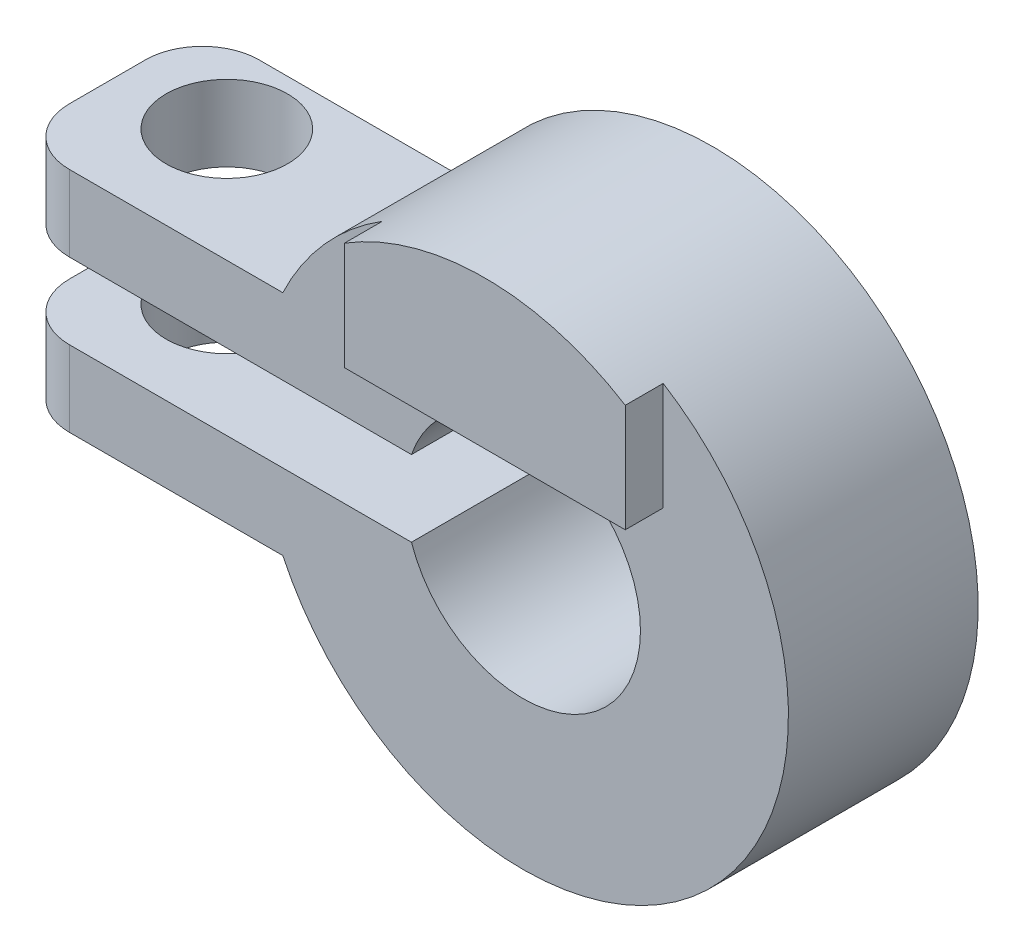
ISO-10303-21;
HEADER;
FILE_DESCRIPTION(('STEP AP214'),'2;1');
FILE_NAME('part.step','',(''),(''),'','','');
FILE_SCHEMA(('AUTOMOTIVE_DESIGN { 1 0 10303 214 1 1 1 1 }'));
ENDSEC;
DATA;
#1=APPLICATION_CONTEXT('core data for automotive mechanical design processes');
#2=APPLICATION_PROTOCOL_DEFINITION('international standard','automotive_design',2000,#1);
#3=PRODUCT_CONTEXT('',#1,'mechanical');
#4=PRODUCT('Part','Part','',(#3));
#5=PRODUCT_RELATED_PRODUCT_CATEGORY('part','',(#4));
#6=PRODUCT_DEFINITION_FORMATION('','',#4);
#7=PRODUCT_DEFINITION_CONTEXT('part definition',#1,'design');
#8=PRODUCT_DEFINITION('design','',#6,#7);
#9=PRODUCT_DEFINITION_SHAPE('','',#8);
#10=(LENGTH_UNIT() NAMED_UNIT(*) SI_UNIT(.MILLI.,.METRE.));
#11=(NAMED_UNIT(*) PLANE_ANGLE_UNIT() SI_UNIT($,.RADIAN.));
#12=(NAMED_UNIT(*) SI_UNIT($,.STERADIAN.) SOLID_ANGLE_UNIT());
#13=UNCERTAINTY_MEASURE_WITH_UNIT(LENGTH_MEASURE(1.E-05),#10,'distance_accuracy_value','');
#14=(GEOMETRIC_REPRESENTATION_CONTEXT(3) GLOBAL_UNCERTAINTY_ASSIGNED_CONTEXT((#13)) GLOBAL_UNIT_ASSIGNED_CONTEXT((#10,
#11,#12)) REPRESENTATION_CONTEXT('',''));
#15=CARTESIAN_POINT('',(0.,0.,0.));
#16=DIRECTION('',(0.,0.,1.));
#17=DIRECTION('',(1.,0.,0.));
#18=AXIS2_PLACEMENT_3D('',#15,#16,#17);
#19=CARTESIAN_POINT('',(0.,3.1,2.));
#20=DIRECTION('',(0.,-1.,0.));
#21=DIRECTION('',(0.,0.,-1.));
#22=AXIS2_PLACEMENT_3D('',#19,#20,#21);
#23=PLANE('',#22);
#24=DIRECTION('',(0.,0.,1.));
#25=VECTOR('',#24,1.);
#26=CARTESIAN_POINT('',(3.7,3.1,-1.));
#27=LINE('',#26,#25);
#28=CARTESIAN_POINT('',(3.7,3.1,-1.));
#29=VERTEX_POINT('',#28);
#30=CARTESIAN_POINT('',(3.7,3.1,0.));
#31=VERTEX_POINT('',#30);
#32=EDGE_CURVE('E184',#29,#31,#27,.T.);
#33=ORIENTED_EDGE('',*,*,#32,.T.);
#34=DIRECTION('',(-1.,0.,0.));
#35=VECTOR('',#34,1.);
#36=CARTESIAN_POINT('',(0.,3.1,0.));
#37=LINE('',#36,#35);
#38=CARTESIAN_POINT('',(-3.7,3.1,0.));
#39=VERTEX_POINT('',#38);
#40=EDGE_CURVE('E166',#31,#39,#37,.T.);
#41=ORIENTED_EDGE('',*,*,#40,.T.);
#42=DIRECTION('',(0.,0.,1.));
#43=VECTOR('',#42,1.);
#44=CARTESIAN_POINT('',(-3.7,3.1,-1.));
#45=LINE('',#44,#43);
#46=CARTESIAN_POINT('',(-3.7,3.1,-1.));
#47=VERTEX_POINT('',#46);
#48=EDGE_CURVE('E181',#47,#39,#45,.T.);
#49=ORIENTED_EDGE('',*,*,#48,.F.);
#50=DIRECTION('',(-1.,0.,0.));
#51=VECTOR('',#50,1.);
#52=CARTESIAN_POINT('',(0.,3.1,-1.));
#53=LINE('',#52,#51);
#54=CARTESIAN_POINT('',(0.,3.1,-1.));
#55=VERTEX_POINT('',#54);
#56=EDGE_CURVE('E301',#55,#47,#53,.T.);
#57=ORIENTED_EDGE('',*,*,#56,.F.);
#58=EDGE_CURVE('E297',#29,#55,#53,.T.);
#59=ORIENTED_EDGE('',*,*,#58,.F.);
#60=EDGE_LOOP('',(#33,#41,#49,#57,#59));
#61=FACE_BOUND('',#60,.T.);
#62=ADVANCED_FACE('F44',(#61),#23,.T.);
#63=CARTESIAN_POINT('',(0.,0.,-1.));
#64=DIRECTION('',(0.,0.,-1.));
#65=DIRECTION('',(-1.,0.,0.));
#66=AXIS2_PLACEMENT_3D('',#63,#64,#65);
#67=PLANE('',#66);
#68=DIRECTION('',(1.,0.,0.));
#69=VECTOR('',#68,1.);
#70=CARTESIAN_POINT('',(-13.4474013388617,-0.999999999999999,-1.));
#71=LINE('',#70,#69);
#72=CARTESIAN_POINT('',(-11.9474013388617,-0.999999999999999,-1.));
#73=VERTEX_POINT('',#72);
#74=CARTESIAN_POINT('',(-2.93428015022424,-0.999999999999999,-1.));
#75=VERTEX_POINT('',#74);
#76=EDGE_CURVE('E274',#73,#75,#71,.T.);
#77=ORIENTED_EDGE('',*,*,#76,.F.);
#78=DIRECTION('',(0.,1.,0.));
#79=VECTOR('',#78,1.);
#80=CARTESIAN_POINT('',(-11.9474013388617,-3.,-1.));
#81=LINE('',#80,#79);
#82=CARTESIAN_POINT('',(-11.9474013388617,-3.,-1.));
#83=VERTEX_POINT('',#82);
#84=EDGE_CURVE('E68',#73,#83,#81,.F.);
#85=ORIENTED_EDGE('',*,*,#84,.T.);
#86=DIRECTION('',(-1.,0.,0.));
#87=VECTOR('',#86,1.);
#88=CARTESIAN_POINT('',(-5.44740133886171,-3.,-1.));
#89=LINE('',#88,#87);
#90=CARTESIAN_POINT('',(-6.32455532033676,-3.,-1.));
#91=VERTEX_POINT('',#90);
#92=EDGE_CURVE('E268',#91,#83,#89,.T.);
#93=ORIENTED_EDGE('',*,*,#92,.F.);
#94=CARTESIAN_POINT('',(0.,0.,-1.));
#95=DIRECTION('',(0.,0.,-1.));
#96=DIRECTION('',(-1.,0.,0.));
#97=AXIS2_PLACEMENT_3D('',#94,#95,#96);
#98=CIRCLE('',#97,7.);
#99=CARTESIAN_POINT('',(3.7,5.94222180669823,-1.));
#100=VERTEX_POINT('',#99);
#101=EDGE_CURVE('E294',#100,#91,#98,.T.);
#102=ORIENTED_EDGE('',*,*,#101,.F.);
#103=DIRECTION('',(0.,-1.,0.));
#104=VECTOR('',#103,1.);
#105=CARTESIAN_POINT('',(3.7,3.1,-1.));
#106=LINE('',#105,#104);
#107=EDGE_CURVE('E195',#100,#29,#106,.T.);
#108=ORIENTED_EDGE('',*,*,#107,.T.);
#109=ORIENTED_EDGE('',*,*,#58,.T.);
#110=CARTESIAN_POINT('',(0.,0.,-1.));
#111=DIRECTION('',(0.,0.,-1.));
#112=DIRECTION('',(-1.,0.,0.));
#113=AXIS2_PLACEMENT_3D('',#110,#111,#112);
#114=CIRCLE('',#113,3.1);
#115=EDGE_CURVE('E287',#55,#75,#114,.T.);
#116=ORIENTED_EDGE('',*,*,#115,.T.);
#117=EDGE_LOOP('',(#77,#85,#93,#102,#108,#109,#116));
#118=FACE_BOUND('',#117,.T.);
#119=ADVANCED_FACE('F316',(#118),#67,.F.);
#120=CARTESIAN_POINT('',(-3.7,3.1,-1.));
#121=DIRECTION('',(1.,0.,0.));
#122=DIRECTION('',(0.,0.,-1.));
#123=AXIS2_PLACEMENT_3D('',#120,#121,#122);
#124=PLANE('',#123);
#125=DIRECTION('',(0.,1.,0.));
#126=VECTOR('',#125,1.);
#127=CARTESIAN_POINT('',(-3.7,3.1,0.));
#128=LINE('',#127,#126);
#129=CARTESIAN_POINT('',(-3.7,5.94222180669823,0.));
#130=VERTEX_POINT('',#129);
#131=EDGE_CURVE('E163',#39,#130,#128,.T.);
#132=ORIENTED_EDGE('',*,*,#131,.T.);
#133=DIRECTION('',(0.,0.,-1.));
#134=VECTOR('',#133,1.);
#135=CARTESIAN_POINT('',(-3.7,5.94222180669823,0.));
#136=LINE('',#135,#134);
#137=CARTESIAN_POINT('',(-3.7,5.94222180669823,-1.));
#138=VERTEX_POINT('',#137);
#139=EDGE_CURVE('E324',#130,#138,#136,.T.);
#140=ORIENTED_EDGE('',*,*,#139,.T.);
#141=DIRECTION('',(0.,1.,0.));
#142=VECTOR('',#141,1.);
#143=CARTESIAN_POINT('',(-3.7,3.1,-1.));
#144=LINE('',#143,#142);
#145=EDGE_CURVE('E190',#47,#138,#144,.T.);
#146=ORIENTED_EDGE('',*,*,#145,.F.);
#147=ORIENTED_EDGE('',*,*,#48,.T.);
#148=EDGE_LOOP('',(#132,#140,#146,#147));
#149=FACE_BOUND('',#148,.T.);
#150=ADVANCED_FACE('F188',(#149),#124,.F.);
#151=CARTESIAN_POINT('',(3.7,3.1,-1.));
#152=DIRECTION('',(-1.,0.,0.));
#153=DIRECTION('',(0.,0.,1.));
#154=AXIS2_PLACEMENT_3D('',#151,#152,#153);
#155=PLANE('',#154);
#156=ORIENTED_EDGE('',*,*,#107,.F.);
#157=DIRECTION('',(0.,0.,-1.));
#158=VECTOR('',#157,1.);
#159=CARTESIAN_POINT('',(3.7,5.94222180669823,0.));
#160=LINE('',#159,#158);
#161=CARTESIAN_POINT('',(3.7,5.94222180669823,0.));
#162=VERTEX_POINT('',#161);
#163=EDGE_CURVE('E331',#100,#162,#160,.F.);
#164=ORIENTED_EDGE('',*,*,#163,.T.);
#165=DIRECTION('',(0.,-1.,0.));
#166=VECTOR('',#165,1.);
#167=CARTESIAN_POINT('',(3.7,3.1,0.));
#168=LINE('',#167,#166);
#169=EDGE_CURVE('E175',#162,#31,#168,.T.);
#170=ORIENTED_EDGE('',*,*,#169,.T.);
#171=ORIENTED_EDGE('',*,*,#32,.F.);
#172=EDGE_LOOP('',(#156,#164,#170,#171));
#173=FACE_BOUND('',#172,.T.);
#174=ADVANCED_FACE('F449',(#173),#155,.F.);
#175=CARTESIAN_POINT('',(0.,0.,-6.));
#176=DIRECTION('',(0.,0.,-1.));
#177=DIRECTION('',(-1.,0.,0.));
#178=AXIS2_PLACEMENT_3D('',#175,#176,#177);
#179=PLANE('',#178);
#180=DIRECTION('',(1.,0.,0.));
#181=VECTOR('',#180,1.);
#182=CARTESIAN_POINT('',(-13.4474013388617,3.,-6.));
#183=LINE('',#182,#181);
#184=CARTESIAN_POINT('',(-11.9474013388617,3.,-6.));
#185=VERTEX_POINT('',#184);
#186=CARTESIAN_POINT('',(-6.32455532033676,3.,-6.));
#187=VERTEX_POINT('',#186);
#188=EDGE_CURVE('E272',#185,#187,#183,.T.);
#189=ORIENTED_EDGE('',*,*,#188,.T.);
#190=CARTESIAN_POINT('',(0.,0.,-6.));
#191=DIRECTION('',(0.,0.,-1.));
#192=DIRECTION('',(-1.,0.,0.));
#193=AXIS2_PLACEMENT_3D('',#190,#191,#192);
#194=CIRCLE('',#193,7.);
#195=CARTESIAN_POINT('',(-6.32455532033676,-3.,-6.));
#196=VERTEX_POINT('',#195);
#197=EDGE_CURVE('E176',#187,#196,#194,.T.);
#198=ORIENTED_EDGE('',*,*,#197,.T.);
#199=DIRECTION('',(-1.,0.,0.));
#200=VECTOR('',#199,1.);
#201=CARTESIAN_POINT('',(-5.44740133886171,-3.,-6.));
#202=LINE('',#201,#200);
#203=CARTESIAN_POINT('',(-11.9474013388617,-3.,-6.));
#204=VERTEX_POINT('',#203);
#205=EDGE_CURVE('E258',#196,#204,#202,.T.);
#206=ORIENTED_EDGE('',*,*,#205,.T.);
#207=DIRECTION('',(0.,1.,0.));
#208=VECTOR('',#207,1.);
#209=CARTESIAN_POINT('',(-11.9474013388617,0.,-6.));
#210=LINE('',#209,#208);
#211=CARTESIAN_POINT('',(-11.9474013388617,-0.999999999999999,-6.));
#212=VERTEX_POINT('',#211);
#213=EDGE_CURVE('E53',#204,#212,#210,.T.);
#214=ORIENTED_EDGE('',*,*,#213,.T.);
#215=DIRECTION('',(1.,0.,0.));
#216=VECTOR('',#215,1.);
#217=CARTESIAN_POINT('',(-13.4474013388617,-0.999999999999999,-6.));
#218=LINE('',#217,#216);
#219=CARTESIAN_POINT('',(-2.93428015022424,-0.999999999999999,-6.));
#220=VERTEX_POINT('',#219);
#221=EDGE_CURVE('E255',#212,#220,#218,.T.);
#222=ORIENTED_EDGE('',*,*,#221,.T.);
#223=CARTESIAN_POINT('',(0.,0.,-6.));
#224=DIRECTION('',(0.,0.,-1.));
#225=DIRECTION('',(-1.,0.,0.));
#226=AXIS2_PLACEMENT_3D('',#223,#224,#225);
#227=CIRCLE('',#226,3.1);
#228=CARTESIAN_POINT('',(-2.93428015022424,1.,-6.));
#229=VERTEX_POINT('',#228);
#230=EDGE_CURVE('E283',#229,#220,#227,.T.);
#231=ORIENTED_EDGE('',*,*,#230,.F.);
#232=DIRECTION('',(-1.,0.,0.));
#233=VECTOR('',#232,1.);
#234=CARTESIAN_POINT('',(-5.44740133886171,1.,-6.));
#235=LINE('',#234,#233);
#236=CARTESIAN_POINT('',(-11.9474013388617,1.,-6.));
#237=VERTEX_POINT('',#236);
#238=EDGE_CURVE('E354',#229,#237,#235,.T.);
#239=ORIENTED_EDGE('',*,*,#238,.T.);
#240=DIRECTION('',(0.,1.,0.));
#241=VECTOR('',#240,1.);
#242=CARTESIAN_POINT('',(-11.9474013388617,0.,-6.));
#243=LINE('',#242,#241);
#244=EDGE_CURVE('E11',#237,#185,#243,.T.);
#245=ORIENTED_EDGE('',*,*,#244,.T.);
#246=EDGE_LOOP('',(#189,#198,#206,#214,#222,#231,#239,#245));
#247=FACE_BOUND('',#246,.T.);
#248=ADVANCED_FACE('F254',(#247),#179,.T.);
#249=DIRECTION('',(1.,0.,0.));
#250=VECTOR('',#249,1.);
#251=CARTESIAN_POINT('',(-13.4474013388617,3.,-1.));
#252=LINE('',#251,#250);
#253=CARTESIAN_POINT('',(-11.9474013388617,3.,-1.));
#254=VERTEX_POINT('',#253);
#255=CARTESIAN_POINT('',(-6.32455532033676,3.,-1.));
#256=VERTEX_POINT('',#255);
#257=EDGE_CURVE('E350',#254,#256,#252,.T.);
#258=ORIENTED_EDGE('',*,*,#257,.F.);
#259=DIRECTION('',(0.,1.,0.));
#260=VECTOR('',#259,1.);
#261=CARTESIAN_POINT('',(-11.9474013388617,1.,-1.));
#262=LINE('',#261,#260);
#263=CARTESIAN_POINT('',(-11.9474013388617,1.,-1.));
#264=VERTEX_POINT('',#263);
#265=EDGE_CURVE('E219',#254,#264,#262,.F.);
#266=ORIENTED_EDGE('',*,*,#265,.T.);
#267=DIRECTION('',(-1.,0.,0.));
#268=VECTOR('',#267,1.);
#269=CARTESIAN_POINT('',(-5.44740133886171,1.,-1.));
#270=LINE('',#269,#268);
#271=CARTESIAN_POINT('',(-2.93428015022424,1.,-1.));
#272=VERTEX_POINT('',#271);
#273=EDGE_CURVE('E353',#272,#264,#270,.T.);
#274=ORIENTED_EDGE('',*,*,#273,.F.);
#275=EDGE_CURVE('E291',#272,#55,#114,.T.);
#276=ORIENTED_EDGE('',*,*,#275,.T.);
#277=ORIENTED_EDGE('',*,*,#56,.T.);
#278=ORIENTED_EDGE('',*,*,#145,.T.);
#279=EDGE_CURVE('E286',#256,#138,#98,.T.);
#280=ORIENTED_EDGE('',*,*,#279,.F.);
#281=EDGE_LOOP('',(#258,#266,#274,#276,#277,#278,#280));
#282=FACE_BOUND('',#281,.T.);
#283=ADVANCED_FACE('F312',(#282),#67,.F.);
#284=CARTESIAN_POINT('',(0.,0.,-6.));
#285=DIRECTION('',(0.,0.,1.));
#286=DIRECTION('',(1.,0.,0.));
#287=AXIS2_PLACEMENT_3D('',#284,#285,#286);
#288=CYLINDRICAL_SURFACE('',#287,7.);
#289=ORIENTED_EDGE('',*,*,#197,.F.);
#290=DIRECTION('',(0.,0.,1.));
#291=VECTOR('',#290,1.);
#292=CARTESIAN_POINT('',(-6.32455532033676,3.,-6.));
#293=LINE('',#292,#291);
#294=EDGE_CURVE('E202',#187,#256,#293,.T.);
#295=ORIENTED_EDGE('',*,*,#294,.T.);
#296=ORIENTED_EDGE('',*,*,#279,.T.);
#297=ORIENTED_EDGE('',*,*,#139,.F.);
#298=CARTESIAN_POINT('',(0.,0.,0.));
#299=DIRECTION('',(0.,0.,1.));
#300=DIRECTION('',(1.,0.,0.));
#301=AXIS2_PLACEMENT_3D('',#298,#299,#300);
#302=CIRCLE('',#301,7.);
#303=EDGE_CURVE('E169',#162,#130,#302,.T.);
#304=ORIENTED_EDGE('',*,*,#303,.F.);
#305=ORIENTED_EDGE('',*,*,#163,.F.);
#306=ORIENTED_EDGE('',*,*,#101,.T.);
#307=DIRECTION('',(0.,0.,1.));
#308=VECTOR('',#307,1.);
#309=CARTESIAN_POINT('',(-6.32455532033676,-3.,-6.));
#310=LINE('',#309,#308);
#311=EDGE_CURVE('E186',#91,#196,#310,.F.);
#312=ORIENTED_EDGE('',*,*,#311,.T.);
#313=EDGE_LOOP('',(#289,#295,#296,#297,#304,#305,#306,#312));
#314=FACE_BOUND('',#313,.T.);
#315=ADVANCED_FACE('F425',(#314),#288,.T.);
#316=CARTESIAN_POINT('',(0.,0.,-6.));
#317=DIRECTION('',(0.,0.,1.));
#318=DIRECTION('',(1.,0.,0.));
#319=AXIS2_PLACEMENT_3D('',#316,#317,#318);
#320=CYLINDRICAL_SURFACE('',#319,3.1);
#321=DIRECTION('',(0.,0.,1.));
#322=VECTOR('',#321,1.);
#323=CARTESIAN_POINT('',(-2.93428015022424,-0.999999999999999,-6.));
#324=LINE('',#323,#322);
#325=EDGE_CURVE('E265',#75,#220,#324,.F.);
#326=ORIENTED_EDGE('',*,*,#325,.F.);
#327=ORIENTED_EDGE('',*,*,#115,.F.);
#328=ORIENTED_EDGE('',*,*,#275,.F.);
#329=DIRECTION('',(0.,0.,1.));
#330=VECTOR('',#329,1.);
#331=CARTESIAN_POINT('',(-2.93428015022424,1.,-6.));
#332=LINE('',#331,#330);
#333=EDGE_CURVE('E323',#229,#272,#332,.T.);
#334=ORIENTED_EDGE('',*,*,#333,.F.);
#335=ORIENTED_EDGE('',*,*,#230,.T.);
#336=EDGE_LOOP('',(#326,#327,#328,#334,#335));
#337=FACE_BOUND('',#336,.T.);
#338=ADVANCED_FACE('F320',(#337),#320,.F.);
#339=CARTESIAN_POINT('',(-13.4474013388617,-0.999999999999999,-1.));
#340=DIRECTION('',(0.,1.,0.));
#341=DIRECTION('',(-1.,0.,0.));
#342=AXIS2_PLACEMENT_3D('',#339,#340,#341);
#343=PLANE('',#342);
#344=CARTESIAN_POINT('',(-10.8,-0.999999999999999,-4.));
#345=DIRECTION('',(0.,1.,0.));
#346=DIRECTION('',(-1.,0.,0.));
#347=AXIS2_PLACEMENT_3D('',#344,#345,#346);
#348=CIRCLE('',#347,1.6);
#349=CARTESIAN_POINT('',(-12.4,-0.999999999999999,-4.));
#350=VERTEX_POINT('',#349);
#351=EDGE_CURVE('E346',#350,#350,#348,.T.);
#352=ORIENTED_EDGE('',*,*,#351,.F.);
#353=EDGE_LOOP('',(#352));
#354=FACE_BOUND('',#353,.T.);
#355=DIRECTION('',(0.,0.,-1.));
#356=VECTOR('',#355,1.);
#357=CARTESIAN_POINT('',(-13.4474013388617,-0.999999999999999,-1.));
#358=LINE('',#357,#356);
#359=CARTESIAN_POINT('',(-13.4474013388617,-0.999999999999999,-2.5));
#360=VERTEX_POINT('',#359);
#361=CARTESIAN_POINT('',(-13.4474013388617,-0.999999999999999,-4.5));
#362=VERTEX_POINT('',#361);
#363=EDGE_CURVE('E277',#360,#362,#358,.T.);
#364=ORIENTED_EDGE('',*,*,#363,.F.);
#365=CARTESIAN_POINT('',(-11.9474013388617,-0.999999999999999,-2.5));
#366=DIRECTION('',(0.,1.,0.));
#367=DIRECTION('',(-1.,0.,0.));
#368=AXIS2_PLACEMENT_3D('',#365,#366,#367);
#369=CIRCLE('',#368,1.5);
#370=EDGE_CURVE('E239',#360,#73,#369,.T.);
#371=ORIENTED_EDGE('',*,*,#370,.T.);
#372=ORIENTED_EDGE('',*,*,#76,.T.);
#373=ORIENTED_EDGE('',*,*,#325,.T.);
#374=ORIENTED_EDGE('',*,*,#221,.F.);
#375=CARTESIAN_POINT('',(-11.9474013388617,-0.999999999999999,-4.5));
#376=DIRECTION('',(0.,1.,0.));
#377=DIRECTION('',(-1.,0.,0.));
#378=AXIS2_PLACEMENT_3D('',#375,#376,#377);
#379=CIRCLE('',#378,1.5);
#380=EDGE_CURVE('E236',#212,#362,#379,.T.);
#381=ORIENTED_EDGE('',*,*,#380,.T.);
#382=EDGE_LOOP('',(#364,#371,#372,#373,#374,#381));
#383=FACE_BOUND('',#382,.T.);
#384=ADVANCED_FACE('F262',(#354,#383),#343,.T.);
#385=CARTESIAN_POINT('',(-5.44740133886171,-3.,-1.));
#386=DIRECTION('',(0.,-1.,0.));
#387=DIRECTION('',(0.,0.,-1.));
#388=AXIS2_PLACEMENT_3D('',#385,#386,#387);
#389=PLANE('',#388);
#390=CARTESIAN_POINT('',(-10.8,-3.,-4.));
#391=DIRECTION('',(0.,-1.,0.));
#392=DIRECTION('',(0.,0.,-1.));
#393=AXIS2_PLACEMENT_3D('',#390,#391,#392);
#394=CIRCLE('',#393,1.6);
#395=CARTESIAN_POINT('',(-10.8,-3.,-5.6));
#396=VERTEX_POINT('',#395);
#397=EDGE_CURVE('E342',#396,#396,#394,.T.);
#398=ORIENTED_EDGE('',*,*,#397,.F.);
#399=EDGE_LOOP('',(#398));
#400=FACE_BOUND('',#399,.T.);
#401=ORIENTED_EDGE('',*,*,#92,.T.);
#402=CARTESIAN_POINT('',(-11.9474013388617,-3.,-2.5));
#403=DIRECTION('',(0.,-1.,0.));
#404=DIRECTION('',(0.,0.,-1.));
#405=AXIS2_PLACEMENT_3D('',#402,#403,#404);
#406=CIRCLE('',#405,1.5);
#407=CARTESIAN_POINT('',(-13.4474013388617,-3.,-2.5));
#408=VERTEX_POINT('',#407);
#409=EDGE_CURVE('E246',#83,#408,#406,.T.);
#410=ORIENTED_EDGE('',*,*,#409,.T.);
#411=DIRECTION('',(0.,0.,-1.));
#412=VECTOR('',#411,1.);
#413=CARTESIAN_POINT('',(-13.4474013388617,-3.,-1.));
#414=LINE('',#413,#412);
#415=CARTESIAN_POINT('',(-13.4474013388617,-3.,-4.5));
#416=VERTEX_POINT('',#415);
#417=EDGE_CURVE('E281',#408,#416,#414,.T.);
#418=ORIENTED_EDGE('',*,*,#417,.T.);
#419=CARTESIAN_POINT('',(-11.9474013388617,-3.,-4.5));
#420=DIRECTION('',(0.,-1.,0.));
#421=DIRECTION('',(0.,0.,-1.));
#422=AXIS2_PLACEMENT_3D('',#419,#420,#421);
#423=CIRCLE('',#422,1.5);
#424=EDGE_CURVE('E60',#416,#204,#423,.T.);
#425=ORIENTED_EDGE('',*,*,#424,.T.);
#426=ORIENTED_EDGE('',*,*,#205,.F.);
#427=ORIENTED_EDGE('',*,*,#311,.F.);
#428=EDGE_LOOP('',(#401,#410,#418,#425,#426,#427));
#429=FACE_BOUND('',#428,.T.);
#430=ADVANCED_FACE('F427',(#400,#429),#389,.T.);
#431=CARTESIAN_POINT('',(-13.4474013388617,-3.,-1.));
#432=DIRECTION('',(-1.,0.,0.));
#433=DIRECTION('',(0.,0.,1.));
#434=AXIS2_PLACEMENT_3D('',#431,#432,#433);
#435=PLANE('',#434);
#436=ORIENTED_EDGE('',*,*,#417,.F.);
#437=DIRECTION('',(0.,1.,0.));
#438=VECTOR('',#437,1.);
#439=CARTESIAN_POINT('',(-13.4474013388617,-0.999999999999999,-2.5));
#440=LINE('',#439,#438);
#441=EDGE_CURVE('E232',#408,#360,#440,.T.);
#442=ORIENTED_EDGE('',*,*,#441,.T.);
#443=ORIENTED_EDGE('',*,*,#363,.T.);
#444=DIRECTION('',(0.,1.,0.));
#445=VECTOR('',#444,1.);
#446=CARTESIAN_POINT('',(-13.4474013388617,-3.,-4.5));
#447=LINE('',#446,#445);
#448=EDGE_CURVE('E229',#362,#416,#447,.F.);
#449=ORIENTED_EDGE('',*,*,#448,.T.);
#450=EDGE_LOOP('',(#436,#442,#443,#449));
#451=FACE_BOUND('',#450,.T.);
#452=ADVANCED_FACE('F374',(#451),#435,.T.);
#453=CARTESIAN_POINT('',(-5.44740133886171,1.,-1.));
#454=DIRECTION('',(0.,-1.,0.));
#455=DIRECTION('',(0.,0.,-1.));
#456=AXIS2_PLACEMENT_3D('',#453,#454,#455);
#457=PLANE('',#456);
#458=CARTESIAN_POINT('',(-10.8,0.999999999999999,-4.));
#459=DIRECTION('',(0.,-1.,0.));
#460=DIRECTION('',(0.,0.,-1.));
#461=AXIS2_PLACEMENT_3D('',#458,#459,#460);
#462=CIRCLE('',#461,1.6);
#463=CARTESIAN_POINT('',(-10.8,0.999999999999999,-5.6));
#464=VERTEX_POINT('',#463);
#465=EDGE_CURVE('E338',#464,#464,#462,.T.);
#466=ORIENTED_EDGE('',*,*,#465,.F.);
#467=EDGE_LOOP('',(#466));
#468=FACE_BOUND('',#467,.T.);
#469=ORIENTED_EDGE('',*,*,#273,.T.);
#470=CARTESIAN_POINT('',(-11.9474013388617,1.,-2.5));
#471=DIRECTION('',(0.,-1.,0.));
#472=DIRECTION('',(0.,0.,-1.));
#473=AXIS2_PLACEMENT_3D('',#470,#471,#472);
#474=CIRCLE('',#473,1.5);
#475=CARTESIAN_POINT('',(-13.4474013388617,1.,-2.5));
#476=VERTEX_POINT('',#475);
#477=EDGE_CURVE('E226',#264,#476,#474,.T.);
#478=ORIENTED_EDGE('',*,*,#477,.T.);
#479=DIRECTION('',(0.,0.,-1.));
#480=VECTOR('',#479,1.);
#481=CARTESIAN_POINT('',(-13.4474013388617,1.,-1.));
#482=LINE('',#481,#480);
#483=CARTESIAN_POINT('',(-13.4474013388617,1.,-4.5));
#484=VERTEX_POINT('',#483);
#485=EDGE_CURVE('E363',#476,#484,#482,.T.);
#486=ORIENTED_EDGE('',*,*,#485,.T.);
#487=CARTESIAN_POINT('',(-11.9474013388617,1.,-4.5));
#488=DIRECTION('',(0.,-1.,0.));
#489=DIRECTION('',(0.,0.,-1.));
#490=AXIS2_PLACEMENT_3D('',#487,#488,#489);
#491=CIRCLE('',#490,1.5);
#492=EDGE_CURVE('E222',#484,#237,#491,.T.);
#493=ORIENTED_EDGE('',*,*,#492,.T.);
#494=ORIENTED_EDGE('',*,*,#238,.F.);
#495=ORIENTED_EDGE('',*,*,#333,.T.);
#496=EDGE_LOOP('',(#469,#478,#486,#493,#494,#495));
#497=FACE_BOUND('',#496,.T.);
#498=ADVANCED_FACE('F412',(#468,#497),#457,.T.);
#499=CARTESIAN_POINT('',(-13.4474013388617,3.,-1.));
#500=DIRECTION('',(0.,1.,0.));
#501=DIRECTION('',(-1.,0.,0.));
#502=AXIS2_PLACEMENT_3D('',#499,#500,#501);
#503=PLANE('',#502);
#504=CARTESIAN_POINT('',(-10.8,3.,-4.));
#505=DIRECTION('',(0.,1.,0.));
#506=DIRECTION('',(-1.,0.,0.));
#507=AXIS2_PLACEMENT_3D('',#504,#505,#506);
#508=CIRCLE('',#507,1.6);
#509=CARTESIAN_POINT('',(-12.4,3.,-4.));
#510=VERTEX_POINT('',#509);
#511=EDGE_CURVE('E329',#510,#510,#508,.T.);
#512=ORIENTED_EDGE('',*,*,#511,.F.);
#513=EDGE_LOOP('',(#512));
#514=FACE_BOUND('',#513,.T.);
#515=DIRECTION('',(0.,0.,-1.));
#516=VECTOR('',#515,1.);
#517=CARTESIAN_POINT('',(-13.4474013388617,3.,-1.));
#518=LINE('',#517,#516);
#519=CARTESIAN_POINT('',(-13.4474013388617,3.,-2.5));
#520=VERTEX_POINT('',#519);
#521=CARTESIAN_POINT('',(-13.4474013388617,3.,-4.5));
#522=VERTEX_POINT('',#521);
#523=EDGE_CURVE('E358',#520,#522,#518,.T.);
#524=ORIENTED_EDGE('',*,*,#523,.F.);
#525=CARTESIAN_POINT('',(-11.9474013388617,3.,-2.5));
#526=DIRECTION('',(0.,1.,0.));
#527=DIRECTION('',(-1.,0.,0.));
#528=AXIS2_PLACEMENT_3D('',#525,#526,#527);
#529=CIRCLE('',#528,1.5);
#530=EDGE_CURVE('E216',#520,#254,#529,.T.);
#531=ORIENTED_EDGE('',*,*,#530,.T.);
#532=ORIENTED_EDGE('',*,*,#257,.T.);
#533=ORIENTED_EDGE('',*,*,#294,.F.);
#534=ORIENTED_EDGE('',*,*,#188,.F.);
#535=CARTESIAN_POINT('',(-11.9474013388617,3.,-4.5));
#536=DIRECTION('',(0.,1.,0.));
#537=DIRECTION('',(-1.,0.,0.));
#538=AXIS2_PLACEMENT_3D('',#535,#536,#537);
#539=CIRCLE('',#538,1.5);
#540=EDGE_CURVE('E213',#185,#522,#539,.T.);
#541=ORIENTED_EDGE('',*,*,#540,.T.);
#542=EDGE_LOOP('',(#524,#531,#532,#533,#534,#541));
#543=FACE_BOUND('',#542,.T.);
#544=ADVANCED_FACE('F423',(#514,#543),#503,.T.);
#545=CARTESIAN_POINT('',(-13.4474013388617,1.,-1.));
#546=DIRECTION('',(-1.,0.,0.));
#547=DIRECTION('',(0.,0.,1.));
#548=AXIS2_PLACEMENT_3D('',#545,#546,#547);
#549=PLANE('',#548);
#550=ORIENTED_EDGE('',*,*,#485,.F.);
#551=DIRECTION('',(0.,1.,0.));
#552=VECTOR('',#551,1.);
#553=CARTESIAN_POINT('',(-13.4474013388617,3.,-2.5));
#554=LINE('',#553,#552);
#555=EDGE_CURVE('E209',#476,#520,#554,.T.);
#556=ORIENTED_EDGE('',*,*,#555,.T.);
#557=ORIENTED_EDGE('',*,*,#523,.T.);
#558=DIRECTION('',(0.,1.,0.));
#559=VECTOR('',#558,1.);
#560=CARTESIAN_POINT('',(-13.4474013388617,1.,-4.5));
#561=LINE('',#560,#559);
#562=EDGE_CURVE('E206',#522,#484,#561,.F.);
#563=ORIENTED_EDGE('',*,*,#562,.T.);
#564=EDGE_LOOP('',(#550,#556,#557,#563));
#565=FACE_BOUND('',#564,.T.);
#566=ADVANCED_FACE('F415',(#565),#549,.T.);
#567=CARTESIAN_POINT('',(-10.8,-14.,-4.));
#568=DIRECTION('',(0.,1.,0.));
#569=DIRECTION('',(-1.,0.,0.));
#570=AXIS2_PLACEMENT_3D('',#567,#568,#569);
#571=CYLINDRICAL_SURFACE('',#570,1.6);
#572=ORIENTED_EDGE('',*,*,#465,.T.);
#573=EDGE_LOOP('',(#572));
#574=FACE_BOUND('',#573,.T.);
#575=ORIENTED_EDGE('',*,*,#511,.T.);
#576=EDGE_LOOP('',(#575));
#577=FACE_BOUND('',#576,.T.);
#578=ADVANCED_FACE('F404',(#574,#577),#571,.F.);
#579=ORIENTED_EDGE('',*,*,#351,.T.);
#580=EDGE_LOOP('',(#579));
#581=FACE_BOUND('',#580,.T.);
#582=ORIENTED_EDGE('',*,*,#397,.T.);
#583=EDGE_LOOP('',(#582));
#584=FACE_BOUND('',#583,.T.);
#585=ADVANCED_FACE('F398',(#581,#584),#571,.F.);
#586=CARTESIAN_POINT('',(-11.9474013388617,1.,-2.5));
#587=DIRECTION('',(0.,-1.,0.));
#588=DIRECTION('',(0.,0.,-1.));
#589=AXIS2_PLACEMENT_3D('',#586,#587,#588);
#590=CYLINDRICAL_SURFACE('',#589,1.5);
#591=ORIENTED_EDGE('',*,*,#477,.F.);
#592=ORIENTED_EDGE('',*,*,#265,.F.);
#593=ORIENTED_EDGE('',*,*,#530,.F.);
#594=ORIENTED_EDGE('',*,*,#555,.F.);
#595=EDGE_LOOP('',(#591,#592,#593,#594));
#596=FACE_BOUND('',#595,.T.);
#597=ADVANCED_FACE('F384',(#596),#590,.T.);
#598=CARTESIAN_POINT('',(-11.9474013388617,-3.,-2.5));
#599=DIRECTION('',(0.,-1.,0.));
#600=DIRECTION('',(0.,0.,-1.));
#601=AXIS2_PLACEMENT_3D('',#598,#599,#600);
#602=CYLINDRICAL_SURFACE('',#601,1.5);
#603=ORIENTED_EDGE('',*,*,#409,.F.);
#604=ORIENTED_EDGE('',*,*,#84,.F.);
#605=ORIENTED_EDGE('',*,*,#370,.F.);
#606=ORIENTED_EDGE('',*,*,#441,.F.);
#607=EDGE_LOOP('',(#603,#604,#605,#606));
#608=FACE_BOUND('',#607,.T.);
#609=ADVANCED_FACE('F378',(#608),#602,.T.);
#610=CARTESIAN_POINT('',(-11.9474013388617,0.,-4.5));
#611=DIRECTION('',(0.,1.,0.));
#612=DIRECTION('',(0.,0.,1.));
#613=AXIS2_PLACEMENT_3D('',#610,#611,#612);
#614=CYLINDRICAL_SURFACE('',#613,1.5);
#615=ORIENTED_EDGE('',*,*,#424,.F.);
#616=ORIENTED_EDGE('',*,*,#448,.F.);
#617=ORIENTED_EDGE('',*,*,#380,.F.);
#618=ORIENTED_EDGE('',*,*,#213,.F.);
#619=EDGE_LOOP('',(#615,#616,#617,#618));
#620=FACE_BOUND('',#619,.T.);
#621=ADVANCED_FACE('F376',(#620),#614,.T.);
#622=CARTESIAN_POINT('',(-11.9474013388617,0.,-4.5));
#623=DIRECTION('',(0.,1.,0.));
#624=DIRECTION('',(0.,0.,1.));
#625=AXIS2_PLACEMENT_3D('',#622,#623,#624);
#626=CYLINDRICAL_SURFACE('',#625,1.5);
#627=ORIENTED_EDGE('',*,*,#492,.F.);
#628=ORIENTED_EDGE('',*,*,#562,.F.);
#629=ORIENTED_EDGE('',*,*,#540,.F.);
#630=ORIENTED_EDGE('',*,*,#244,.F.);
#631=EDGE_LOOP('',(#627,#628,#629,#630));
#632=FACE_BOUND('',#631,.T.);
#633=ADVANCED_FACE('F46',(#632),#626,.T.);
#634=CARTESIAN_POINT('',(0.,0.,0.));
#635=DIRECTION('',(0.,0.,1.));
#636=DIRECTION('',(1.,0.,0.));
#637=AXIS2_PLACEMENT_3D('',#634,#635,#636);
#638=PLANE('',#637);
#639=ORIENTED_EDGE('',*,*,#169,.F.);
#640=ORIENTED_EDGE('',*,*,#303,.T.);
#641=ORIENTED_EDGE('',*,*,#131,.F.);
#642=ORIENTED_EDGE('',*,*,#40,.F.);
#643=EDGE_LOOP('',(#639,#640,#641,#642));
#644=FACE_BOUND('',#643,.T.);
#645=ADVANCED_FACE('F165',(#644),#638,.T.);
#646=CLOSED_SHELL('',(#62,#119,#150,#174,#248,#283,#315,#338,#384,#430,#452,#498,#544,#566,#578,
#585,#597,#609,#621,#633,#645));
#647=MANIFOLD_SOLID_BREP('B2',#646);
#648=ADVANCED_BREP_SHAPE_REPRESENTATION('',(#18,#647),#14);
#649=SHAPE_DEFINITION_REPRESENTATION(#9,#648);
ENDSEC;
END-ISO-10303-21;
